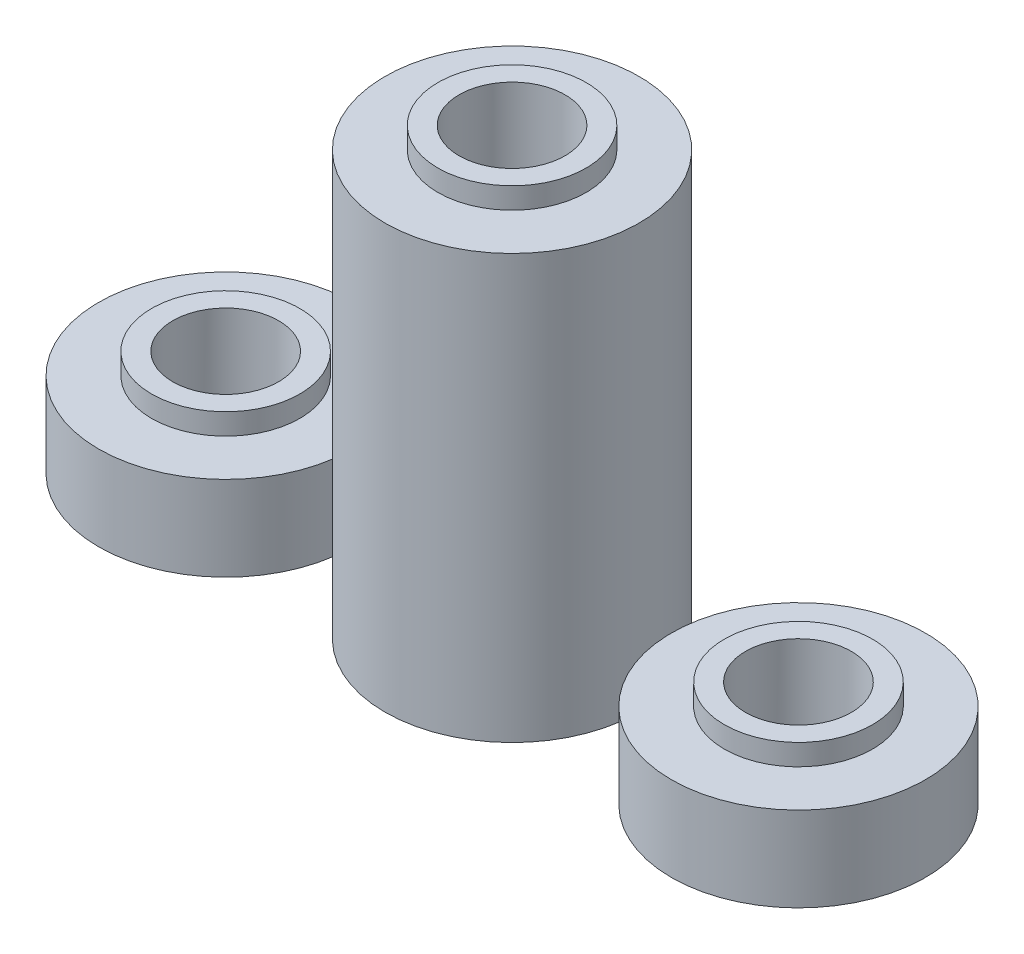
ISO-10303-21;
HEADER;
FILE_DESCRIPTION(('STEP AP214'),'2;1');
FILE_NAME('part.step','',(''),(''),'','','');
FILE_SCHEMA(('AUTOMOTIVE_DESIGN { 1 0 10303 214 1 1 1 1 }'));
ENDSEC;
DATA;
#1=APPLICATION_CONTEXT('core data for automotive mechanical design processes');
#2=APPLICATION_PROTOCOL_DEFINITION('international standard','automotive_design',2000,#1);
#3=PRODUCT_CONTEXT('',#1,'mechanical');
#4=PRODUCT('Part','Part','',(#3));
#5=PRODUCT_RELATED_PRODUCT_CATEGORY('part','',(#4));
#6=PRODUCT_DEFINITION_FORMATION('','',#4);
#7=PRODUCT_DEFINITION_CONTEXT('part definition',#1,'design');
#8=PRODUCT_DEFINITION('design','',#6,#7);
#9=PRODUCT_DEFINITION_SHAPE('','',#8);
#10=(LENGTH_UNIT() NAMED_UNIT(*) SI_UNIT(.MILLI.,.METRE.));
#11=(NAMED_UNIT(*) PLANE_ANGLE_UNIT() SI_UNIT($,.RADIAN.));
#12=(NAMED_UNIT(*) SI_UNIT($,.STERADIAN.) SOLID_ANGLE_UNIT());
#13=UNCERTAINTY_MEASURE_WITH_UNIT(LENGTH_MEASURE(1.E-05),#10,'distance_accuracy_value','');
#14=(GEOMETRIC_REPRESENTATION_CONTEXT(3) GLOBAL_UNCERTAINTY_ASSIGNED_CONTEXT((#13)) GLOBAL_UNIT_ASSIGNED_CONTEXT((#10,
#11,#12)) REPRESENTATION_CONTEXT('',''));
#15=CARTESIAN_POINT('',(0.,0.,0.));
#16=DIRECTION('',(0.,0.,1.));
#17=DIRECTION('',(1.,0.,0.));
#18=AXIS2_PLACEMENT_3D('',#15,#16,#17);
#19=CARTESIAN_POINT('',(13.5219915750708,0.,0.));
#20=DIRECTION('',(0.,1.,0.));
#21=DIRECTION('',(0.,0.,1.));
#22=AXIS2_PLACEMENT_3D('',#19,#20,#21);
#23=CYLINDRICAL_SURFACE('',#22,2.5);
#24=CARTESIAN_POINT('',(13.5219915750708,5.,0.));
#25=DIRECTION('',(0.,-1.,0.));
#26=DIRECTION('',(0.,0.,1.));
#27=AXIS2_PLACEMENT_3D('',#24,#25,#26);
#28=CIRCLE('',#27,2.5);
#29=CARTESIAN_POINT('',(13.5219915750708,5.,2.5));
#30=VERTEX_POINT('',#29);
#31=EDGE_CURVE('E62',#30,#30,#28,.T.);
#32=ORIENTED_EDGE('',*,*,#31,.F.);
#33=EDGE_LOOP('',(#32));
#34=FACE_BOUND('',#33,.T.);
#35=CARTESIAN_POINT('',(13.5219915750708,1.,0.));
#36=DIRECTION('',(0.,1.,0.));
#37=DIRECTION('',(0.,0.,-1.));
#38=AXIS2_PLACEMENT_3D('',#35,#36,#37);
#39=CIRCLE('',#38,2.5);
#40=CARTESIAN_POINT('',(13.5219915750708,1.,-2.5));
#41=VERTEX_POINT('',#40);
#42=EDGE_CURVE('E71',#41,#41,#39,.T.);
#43=ORIENTED_EDGE('',*,*,#42,.F.);
#44=EDGE_LOOP('',(#43));
#45=FACE_BOUND('',#44,.T.);
#46=ADVANCED_FACE('F46',(#34,#45),#23,.F.);
#47=CARTESIAN_POINT('',(13.5219915750708,4.,0.));
#48=DIRECTION('',(0.,1.,0.));
#49=DIRECTION('',(0.,0.,1.));
#50=AXIS2_PLACEMENT_3D('',#47,#48,#49);
#51=PLANE('',#50);
#52=CARTESIAN_POINT('',(13.5219915750708,4.,0.));
#53=DIRECTION('',(0.,-1.,0.));
#54=DIRECTION('',(0.,0.,1.));
#55=AXIS2_PLACEMENT_3D('',#52,#53,#54);
#56=CIRCLE('',#55,6.);
#57=CARTESIAN_POINT('',(13.5219915750708,4.,6.));
#58=VERTEX_POINT('',#57);
#59=EDGE_CURVE('E11',#58,#58,#56,.T.);
#60=ORIENTED_EDGE('',*,*,#59,.F.);
#61=EDGE_LOOP('',(#60));
#62=FACE_BOUND('',#61,.T.);
#63=CARTESIAN_POINT('',(13.5219915750708,4.,0.));
#64=DIRECTION('',(0.,-1.,0.));
#65=DIRECTION('',(0.,0.,1.));
#66=AXIS2_PLACEMENT_3D('',#63,#64,#65);
#67=CIRCLE('',#66,3.5);
#68=CARTESIAN_POINT('',(13.5219915750708,4.,3.5));
#69=VERTEX_POINT('',#68);
#70=EDGE_CURVE('E59',#69,#69,#67,.T.);
#71=ORIENTED_EDGE('',*,*,#70,.T.);
#72=EDGE_LOOP('',(#71));
#73=FACE_BOUND('',#72,.T.);
#74=ADVANCED_FACE('F81',(#62,#73),#51,.T.);
#75=CARTESIAN_POINT('',(13.5219915750708,4.,0.));
#76=DIRECTION('',(0.,-1.,0.));
#77=DIRECTION('',(0.,0.,-1.));
#78=AXIS2_PLACEMENT_3D('',#75,#76,#77);
#79=CYLINDRICAL_SURFACE('',#78,6.);
#80=ORIENTED_EDGE('',*,*,#59,.T.);
#81=EDGE_LOOP('',(#80));
#82=FACE_BOUND('',#81,.T.);
#83=CARTESIAN_POINT('',(13.5219915750708,0.,0.));
#84=DIRECTION('',(0.,-1.,0.));
#85=DIRECTION('',(0.,0.,1.));
#86=AXIS2_PLACEMENT_3D('',#83,#84,#85);
#87=CIRCLE('',#86,6.);
#88=CARTESIAN_POINT('',(13.5219915750708,0.,6.));
#89=VERTEX_POINT('',#88);
#90=EDGE_CURVE('E50',#89,#89,#87,.T.);
#91=ORIENTED_EDGE('',*,*,#90,.F.);
#92=EDGE_LOOP('',(#91));
#93=FACE_BOUND('',#92,.T.);
#94=ADVANCED_FACE('F48',(#82,#93),#79,.T.);
#95=CARTESIAN_POINT('',(13.5219915750708,0.,0.));
#96=DIRECTION('',(0.,1.,0.));
#97=DIRECTION('',(0.,0.,1.));
#98=AXIS2_PLACEMENT_3D('',#95,#96,#97);
#99=PLANE('',#98);
#100=CARTESIAN_POINT('',(13.5219915750708,0.,0.));
#101=DIRECTION('',(0.,1.,0.));
#102=DIRECTION('',(0.,0.,-1.));
#103=AXIS2_PLACEMENT_3D('',#100,#101,#102);
#104=CIRCLE('',#103,3.5);
#105=CARTESIAN_POINT('',(13.5219915750708,0.,-3.5));
#106=VERTEX_POINT('',#105);
#107=EDGE_CURVE('E68',#106,#106,#104,.T.);
#108=ORIENTED_EDGE('',*,*,#107,.T.);
#109=EDGE_LOOP('',(#108));
#110=FACE_BOUND('',#109,.T.);
#111=ORIENTED_EDGE('',*,*,#90,.T.);
#112=EDGE_LOOP('',(#111));
#113=FACE_BOUND('',#112,.T.);
#114=ADVANCED_FACE('F93',(#110,#113),#99,.F.);
#115=CARTESIAN_POINT('',(13.5219915750708,5.,0.));
#116=DIRECTION('',(0.,1.,0.));
#117=DIRECTION('',(0.,0.,1.));
#118=AXIS2_PLACEMENT_3D('',#115,#116,#117);
#119=PLANE('',#118);
#120=CARTESIAN_POINT('',(13.5219915750708,5.,0.));
#121=DIRECTION('',(0.,-1.,0.));
#122=DIRECTION('',(0.,0.,1.));
#123=AXIS2_PLACEMENT_3D('',#120,#121,#122);
#124=CIRCLE('',#123,3.5);
#125=CARTESIAN_POINT('',(13.5219915750708,5.,3.5));
#126=VERTEX_POINT('',#125);
#127=EDGE_CURVE('E57',#126,#126,#124,.T.);
#128=ORIENTED_EDGE('',*,*,#127,.F.);
#129=EDGE_LOOP('',(#128));
#130=FACE_BOUND('',#129,.T.);
#131=ORIENTED_EDGE('',*,*,#31,.T.);
#132=EDGE_LOOP('',(#131));
#133=FACE_BOUND('',#132,.T.);
#134=ADVANCED_FACE('F95',(#130,#133),#119,.T.);
#135=CARTESIAN_POINT('',(13.5219915750708,5.,0.));
#136=DIRECTION('',(0.,-1.,0.));
#137=DIRECTION('',(0.,0.,-1.));
#138=AXIS2_PLACEMENT_3D('',#135,#136,#137);
#139=CYLINDRICAL_SURFACE('',#138,3.5);
#140=ORIENTED_EDGE('',*,*,#127,.T.);
#141=EDGE_LOOP('',(#140));
#142=FACE_BOUND('',#141,.T.);
#143=ORIENTED_EDGE('',*,*,#70,.F.);
#144=EDGE_LOOP('',(#143));
#145=FACE_BOUND('',#144,.T.);
#146=ADVANCED_FACE('F91',(#142,#145),#139,.T.);
#147=CARTESIAN_POINT('',(13.5219915750708,1.,0.));
#148=DIRECTION('',(0.,-1.,0.));
#149=DIRECTION('',(0.,0.,-1.));
#150=AXIS2_PLACEMENT_3D('',#147,#148,#149);
#151=CYLINDRICAL_SURFACE('',#150,3.5);
#152=CARTESIAN_POINT('',(13.5219915750708,1.,0.));
#153=DIRECTION('',(0.,1.,0.));
#154=DIRECTION('',(0.,0.,-1.));
#155=AXIS2_PLACEMENT_3D('',#152,#153,#154);
#156=CIRCLE('',#155,3.5);
#157=CARTESIAN_POINT('',(13.5219915750708,1.,-3.5));
#158=VERTEX_POINT('',#157);
#159=EDGE_CURVE('E67',#158,#158,#156,.T.);
#160=ORIENTED_EDGE('',*,*,#159,.T.);
#161=EDGE_LOOP('',(#160));
#162=FACE_BOUND('',#161,.T.);
#163=ORIENTED_EDGE('',*,*,#107,.F.);
#164=EDGE_LOOP('',(#163));
#165=FACE_BOUND('',#164,.T.);
#166=ADVANCED_FACE('F107',(#162,#165),#151,.F.);
#167=CARTESIAN_POINT('',(13.5219915750708,1.,0.));
#168=DIRECTION('',(0.,-1.,0.));
#169=DIRECTION('',(0.,0.,-1.));
#170=AXIS2_PLACEMENT_3D('',#167,#168,#169);
#171=PLANE('',#170);
#172=ORIENTED_EDGE('',*,*,#42,.T.);
#173=EDGE_LOOP('',(#172));
#174=FACE_BOUND('',#173,.T.);
#175=ORIENTED_EDGE('',*,*,#159,.F.);
#176=EDGE_LOOP('',(#175));
#177=FACE_BOUND('',#176,.T.);
#178=ADVANCED_FACE('F77',(#174,#177),#171,.T.);
#179=CLOSED_SHELL('',(#46,#74,#94,#114,#134,#146,#166,#178));
#180=MANIFOLD_SOLID_BREP('B2',#179);
#181=CARTESIAN_POINT('',(-13.5219915750708,0.,0.));
#182=DIRECTION('',(0.,1.,0.));
#183=DIRECTION('',(0.,0.,1.));
#184=AXIS2_PLACEMENT_3D('',#181,#182,#183);
#185=CYLINDRICAL_SURFACE('',#184,2.5);
#186=CARTESIAN_POINT('',(-13.5219915750708,5.,0.));
#187=DIRECTION('',(0.,1.,0.));
#188=DIRECTION('',(0.,0.,1.));
#189=AXIS2_PLACEMENT_3D('',#186,#187,#188);
#190=CIRCLE('',#189,2.5);
#191=CARTESIAN_POINT('',(-13.5219915750708,5.,2.5));
#192=VERTEX_POINT('',#191);
#193=EDGE_CURVE('E194',#192,#192,#190,.T.);
#194=ORIENTED_EDGE('',*,*,#193,.T.);
#195=EDGE_LOOP('',(#194));
#196=FACE_BOUND('',#195,.T.);
#197=CARTESIAN_POINT('',(-13.5219915750708,1.,0.));
#198=DIRECTION('',(0.,-1.,0.));
#199=DIRECTION('',(0.,0.,-1.));
#200=AXIS2_PLACEMENT_3D('',#197,#198,#199);
#201=CIRCLE('',#200,2.5);
#202=CARTESIAN_POINT('',(-13.5219915750708,1.,-2.5));
#203=VERTEX_POINT('',#202);
#204=EDGE_CURVE('E203',#203,#203,#201,.T.);
#205=ORIENTED_EDGE('',*,*,#204,.T.);
#206=EDGE_LOOP('',(#205));
#207=FACE_BOUND('',#206,.T.);
#208=ADVANCED_FACE('F178',(#196,#207),#185,.F.);
#209=CARTESIAN_POINT('',(-13.5219915750708,4.,0.));
#210=DIRECTION('',(0.,1.,0.));
#211=DIRECTION('',(0.,0.,1.));
#212=AXIS2_PLACEMENT_3D('',#209,#210,#211);
#213=PLANE('',#212);
#214=CARTESIAN_POINT('',(-13.5219915750708,4.,0.));
#215=DIRECTION('',(0.,1.,0.));
#216=DIRECTION('',(0.,0.,1.));
#217=AXIS2_PLACEMENT_3D('',#214,#215,#216);
#218=CIRCLE('',#217,6.);
#219=CARTESIAN_POINT('',(-13.5219915750708,4.,6.));
#220=VERTEX_POINT('',#219);
#221=EDGE_CURVE('E45',#220,#220,#218,.T.);
#222=ORIENTED_EDGE('',*,*,#221,.T.);
#223=EDGE_LOOP('',(#222));
#224=FACE_BOUND('',#223,.T.);
#225=CARTESIAN_POINT('',(-13.5219915750708,4.,0.));
#226=DIRECTION('',(0.,1.,0.));
#227=DIRECTION('',(0.,0.,1.));
#228=AXIS2_PLACEMENT_3D('',#225,#226,#227);
#229=CIRCLE('',#228,3.5);
#230=CARTESIAN_POINT('',(-13.5219915750708,4.,3.5));
#231=VERTEX_POINT('',#230);
#232=EDGE_CURVE('E191',#231,#231,#229,.T.);
#233=ORIENTED_EDGE('',*,*,#232,.F.);
#234=EDGE_LOOP('',(#233));
#235=FACE_BOUND('',#234,.T.);
#236=ADVANCED_FACE('F230',(#224,#235),#213,.T.);
#237=CARTESIAN_POINT('',(-13.5219915750708,4.,0.));
#238=DIRECTION('',(0.,-1.,0.));
#239=DIRECTION('',(0.,0.,-1.));
#240=AXIS2_PLACEMENT_3D('',#237,#238,#239);
#241=CYLINDRICAL_SURFACE('',#240,6.);
#242=ORIENTED_EDGE('',*,*,#221,.F.);
#243=EDGE_LOOP('',(#242));
#244=FACE_BOUND('',#243,.T.);
#245=CARTESIAN_POINT('',(-13.5219915750708,0.,0.));
#246=DIRECTION('',(0.,1.,0.));
#247=DIRECTION('',(0.,0.,1.));
#248=AXIS2_PLACEMENT_3D('',#245,#246,#247);
#249=CIRCLE('',#248,6.);
#250=CARTESIAN_POINT('',(-13.5219915750708,0.,6.));
#251=VERTEX_POINT('',#250);
#252=EDGE_CURVE('E182',#251,#251,#249,.T.);
#253=ORIENTED_EDGE('',*,*,#252,.T.);
#254=EDGE_LOOP('',(#253));
#255=FACE_BOUND('',#254,.T.);
#256=ADVANCED_FACE('F180',(#244,#255),#241,.T.);
#257=CARTESIAN_POINT('',(-13.5219915750708,0.,0.));
#258=DIRECTION('',(0.,1.,0.));
#259=DIRECTION('',(0.,0.,1.));
#260=AXIS2_PLACEMENT_3D('',#257,#258,#259);
#261=PLANE('',#260);
#262=CARTESIAN_POINT('',(-13.5219915750708,0.,0.));
#263=DIRECTION('',(0.,-1.,0.));
#264=DIRECTION('',(0.,0.,-1.));
#265=AXIS2_PLACEMENT_3D('',#262,#263,#264);
#266=CIRCLE('',#265,3.5);
#267=CARTESIAN_POINT('',(-13.5219915750708,0.,-3.5));
#268=VERTEX_POINT('',#267);
#269=EDGE_CURVE('E200',#268,#268,#266,.T.);
#270=ORIENTED_EDGE('',*,*,#269,.F.);
#271=EDGE_LOOP('',(#270));
#272=FACE_BOUND('',#271,.T.);
#273=ORIENTED_EDGE('',*,*,#252,.F.);
#274=EDGE_LOOP('',(#273));
#275=FACE_BOUND('',#274,.T.);
#276=ADVANCED_FACE('F223',(#272,#275),#261,.F.);
#277=CARTESIAN_POINT('',(-13.5219915750708,5.,0.));
#278=DIRECTION('',(0.,1.,0.));
#279=DIRECTION('',(0.,0.,1.));
#280=AXIS2_PLACEMENT_3D('',#277,#278,#279);
#281=PLANE('',#280);
#282=CARTESIAN_POINT('',(-13.5219915750708,5.,0.));
#283=DIRECTION('',(0.,1.,0.));
#284=DIRECTION('',(0.,0.,1.));
#285=AXIS2_PLACEMENT_3D('',#282,#283,#284);
#286=CIRCLE('',#285,3.5);
#287=CARTESIAN_POINT('',(-13.5219915750708,5.,3.5));
#288=VERTEX_POINT('',#287);
#289=EDGE_CURVE('E189',#288,#288,#286,.T.);
#290=ORIENTED_EDGE('',*,*,#289,.T.);
#291=EDGE_LOOP('',(#290));
#292=FACE_BOUND('',#291,.T.);
#293=ORIENTED_EDGE('',*,*,#193,.F.);
#294=EDGE_LOOP('',(#293));
#295=FACE_BOUND('',#294,.T.);
#296=ADVANCED_FACE('F226',(#292,#295),#281,.T.);
#297=CARTESIAN_POINT('',(-13.5219915750708,5.,0.));
#298=DIRECTION('',(0.,-1.,0.));
#299=DIRECTION('',(0.,0.,-1.));
#300=AXIS2_PLACEMENT_3D('',#297,#298,#299);
#301=CYLINDRICAL_SURFACE('',#300,3.5);
#302=ORIENTED_EDGE('',*,*,#289,.F.);
#303=EDGE_LOOP('',(#302));
#304=FACE_BOUND('',#303,.T.);
#305=ORIENTED_EDGE('',*,*,#232,.T.);
#306=EDGE_LOOP('',(#305));
#307=FACE_BOUND('',#306,.T.);
#308=ADVANCED_FACE('F219',(#304,#307),#301,.T.);
#309=CARTESIAN_POINT('',(-13.5219915750708,1.,0.));
#310=DIRECTION('',(0.,-1.,0.));
#311=DIRECTION('',(0.,0.,-1.));
#312=AXIS2_PLACEMENT_3D('',#309,#310,#311);
#313=CYLINDRICAL_SURFACE('',#312,3.5);
#314=CARTESIAN_POINT('',(-13.5219915750708,1.,0.));
#315=DIRECTION('',(0.,-1.,0.));
#316=DIRECTION('',(0.,0.,-1.));
#317=AXIS2_PLACEMENT_3D('',#314,#315,#316);
#318=CIRCLE('',#317,3.5);
#319=CARTESIAN_POINT('',(-13.5219915750708,1.,-3.5));
#320=VERTEX_POINT('',#319);
#321=EDGE_CURVE('E199',#320,#320,#318,.T.);
#322=ORIENTED_EDGE('',*,*,#321,.F.);
#323=EDGE_LOOP('',(#322));
#324=FACE_BOUND('',#323,.T.);
#325=ORIENTED_EDGE('',*,*,#269,.T.);
#326=EDGE_LOOP('',(#325));
#327=FACE_BOUND('',#326,.T.);
#328=ADVANCED_FACE('F213',(#324,#327),#313,.F.);
#329=CARTESIAN_POINT('',(-13.5219915750708,1.,0.));
#330=DIRECTION('',(0.,-1.,0.));
#331=DIRECTION('',(0.,0.,-1.));
#332=AXIS2_PLACEMENT_3D('',#329,#330,#331);
#333=PLANE('',#332);
#334=ORIENTED_EDGE('',*,*,#204,.F.);
#335=EDGE_LOOP('',(#334));
#336=FACE_BOUND('',#335,.T.);
#337=ORIENTED_EDGE('',*,*,#321,.T.);
#338=EDGE_LOOP('',(#337));
#339=FACE_BOUND('',#338,.T.);
#340=ADVANCED_FACE('F210',(#336,#339),#333,.T.);
#341=CLOSED_SHELL('',(#208,#236,#256,#276,#296,#308,#328,#340));
#342=MANIFOLD_SOLID_BREP('B6',#341);
#343=CARTESIAN_POINT('',(0.,0.,0.));
#344=DIRECTION('',(0.,1.,0.));
#345=DIRECTION('',(0.,0.,1.));
#346=AXIS2_PLACEMENT_3D('',#343,#344,#345);
#347=CYLINDRICAL_SURFACE('',#346,2.5);
#348=CARTESIAN_POINT('',(0.,21.,0.));
#349=DIRECTION('',(0.,1.,0.));
#350=DIRECTION('',(0.,0.,1.));
#351=AXIS2_PLACEMENT_3D('',#348,#349,#350);
#352=CIRCLE('',#351,2.5);
#353=CARTESIAN_POINT('',(0.,21.,2.5));
#354=VERTEX_POINT('',#353);
#355=EDGE_CURVE('E324',#354,#354,#352,.T.);
#356=ORIENTED_EDGE('',*,*,#355,.T.);
#357=EDGE_LOOP('',(#356));
#358=FACE_BOUND('',#357,.T.);
#359=CARTESIAN_POINT('',(0.,5.,0.));
#360=DIRECTION('',(0.,-1.,0.));
#361=DIRECTION('',(0.,0.,-1.));
#362=AXIS2_PLACEMENT_3D('',#359,#360,#361);
#363=CIRCLE('',#362,2.5);
#364=CARTESIAN_POINT('',(0.,5.,-2.5));
#365=VERTEX_POINT('',#364);
#366=EDGE_CURVE('E307',#365,#365,#363,.F.);
#367=ORIENTED_EDGE('',*,*,#366,.F.);
#368=EDGE_LOOP('',(#367));
#369=FACE_BOUND('',#368,.T.);
#370=ADVANCED_FACE('F303',(#358,#369),#347,.F.);
#371=CARTESIAN_POINT('',(0.,20.,0.));
#372=DIRECTION('',(0.,1.,0.));
#373=DIRECTION('',(0.,0.,1.));
#374=AXIS2_PLACEMENT_3D('',#371,#372,#373);
#375=PLANE('',#374);
#376=CARTESIAN_POINT('',(0.,20.,0.));
#377=DIRECTION('',(0.,1.,0.));
#378=DIRECTION('',(0.,0.,1.));
#379=AXIS2_PLACEMENT_3D('',#376,#377,#378);
#380=CIRCLE('',#379,6.);
#381=CARTESIAN_POINT('',(0.,20.,6.));
#382=VERTEX_POINT('',#381);
#383=EDGE_CURVE('E177',#382,#382,#380,.T.);
#384=ORIENTED_EDGE('',*,*,#383,.T.);
#385=EDGE_LOOP('',(#384));
#386=FACE_BOUND('',#385,.T.);
#387=CARTESIAN_POINT('',(0.,20.,0.));
#388=DIRECTION('',(0.,1.,0.));
#389=DIRECTION('',(0.,0.,1.));
#390=AXIS2_PLACEMENT_3D('',#387,#388,#389);
#391=CIRCLE('',#390,3.5);
#392=CARTESIAN_POINT('',(0.,20.,3.5));
#393=VERTEX_POINT('',#392);
#394=EDGE_CURVE('E320',#393,#393,#391,.T.);
#395=ORIENTED_EDGE('',*,*,#394,.F.);
#396=EDGE_LOOP('',(#395));
#397=FACE_BOUND('',#396,.T.);
#398=ADVANCED_FACE('F347',(#386,#397),#375,.T.);
#399=CARTESIAN_POINT('',(0.,20.,0.));
#400=DIRECTION('',(0.,-1.,0.));
#401=DIRECTION('',(0.,0.,-1.));
#402=AXIS2_PLACEMENT_3D('',#399,#400,#401);
#403=CYLINDRICAL_SURFACE('',#402,6.);
#404=ORIENTED_EDGE('',*,*,#383,.F.);
#405=EDGE_LOOP('',(#404));
#406=FACE_BOUND('',#405,.T.);
#407=CARTESIAN_POINT('',(0.,0.,0.));
#408=DIRECTION('',(0.,1.,0.));
#409=DIRECTION('',(0.,0.,1.));
#410=AXIS2_PLACEMENT_3D('',#407,#408,#409);
#411=CIRCLE('',#410,6.);
#412=CARTESIAN_POINT('',(0.,0.,6.));
#413=VERTEX_POINT('',#412);
#414=EDGE_CURVE('E312',#413,#413,#411,.T.);
#415=ORIENTED_EDGE('',*,*,#414,.T.);
#416=EDGE_LOOP('',(#415));
#417=FACE_BOUND('',#416,.T.);
#418=ADVANCED_FACE('F305',(#406,#417),#403,.T.);
#419=CARTESIAN_POINT('',(0.,0.,0.));
#420=DIRECTION('',(0.,1.,0.));
#421=DIRECTION('',(0.,0.,1.));
#422=AXIS2_PLACEMENT_3D('',#419,#420,#421);
#423=PLANE('',#422);
#424=CARTESIAN_POINT('',(0.,0.,0.));
#425=DIRECTION('',(0.,-1.,0.));
#426=DIRECTION('',(0.,0.,-1.));
#427=AXIS2_PLACEMENT_3D('',#424,#425,#426);
#428=CIRCLE('',#427,4.5);
#429=CARTESIAN_POINT('',(0.,0.,-4.5));
#430=VERTEX_POINT('',#429);
#431=EDGE_CURVE('E331',#430,#430,#428,.T.);
#432=ORIENTED_EDGE('',*,*,#431,.F.);
#433=EDGE_LOOP('',(#432));
#434=FACE_BOUND('',#433,.T.);
#435=ORIENTED_EDGE('',*,*,#414,.F.);
#436=EDGE_LOOP('',(#435));
#437=FACE_BOUND('',#436,.T.);
#438=ADVANCED_FACE('F357',(#434,#437),#423,.F.);
#439=CARTESIAN_POINT('',(0.,21.,0.));
#440=DIRECTION('',(0.,1.,0.));
#441=DIRECTION('',(0.,0.,1.));
#442=AXIS2_PLACEMENT_3D('',#439,#440,#441);
#443=PLANE('',#442);
#444=CARTESIAN_POINT('',(0.,21.,0.));
#445=DIRECTION('',(0.,1.,0.));
#446=DIRECTION('',(0.,0.,1.));
#447=AXIS2_PLACEMENT_3D('',#444,#445,#446);
#448=CIRCLE('',#447,3.5);
#449=CARTESIAN_POINT('',(0.,21.,3.5));
#450=VERTEX_POINT('',#449);
#451=EDGE_CURVE('E318',#450,#450,#448,.T.);
#452=ORIENTED_EDGE('',*,*,#451,.T.);
#453=EDGE_LOOP('',(#452));
#454=FACE_BOUND('',#453,.T.);
#455=ORIENTED_EDGE('',*,*,#355,.F.);
#456=EDGE_LOOP('',(#455));
#457=FACE_BOUND('',#456,.T.);
#458=ADVANCED_FACE('F359',(#454,#457),#443,.T.);
#459=CARTESIAN_POINT('',(0.,21.,0.));
#460=DIRECTION('',(0.,-1.,0.));
#461=DIRECTION('',(0.,0.,-1.));
#462=AXIS2_PLACEMENT_3D('',#459,#460,#461);
#463=CYLINDRICAL_SURFACE('',#462,3.5);
#464=ORIENTED_EDGE('',*,*,#451,.F.);
#465=EDGE_LOOP('',(#464));
#466=FACE_BOUND('',#465,.T.);
#467=ORIENTED_EDGE('',*,*,#394,.T.);
#468=EDGE_LOOP('',(#467));
#469=FACE_BOUND('',#468,.T.);
#470=ADVANCED_FACE('F355',(#466,#469),#463,.T.);
#471=CARTESIAN_POINT('',(0.,5.,0.));
#472=DIRECTION('',(0.,-1.,0.));
#473=DIRECTION('',(0.,0.,-1.));
#474=AXIS2_PLACEMENT_3D('',#471,#472,#473);
#475=PLANE('',#474);
#476=CARTESIAN_POINT('',(0.,5.,0.));
#477=DIRECTION('',(0.,-1.,0.));
#478=DIRECTION('',(0.,0.,-1.));
#479=AXIS2_PLACEMENT_3D('',#476,#477,#478);
#480=CIRCLE('',#479,4.5);
#481=CARTESIAN_POINT('',(0.,5.,-4.5));
#482=VERTEX_POINT('',#481);
#483=EDGE_CURVE('E335',#482,#482,#480,.T.);
#484=ORIENTED_EDGE('',*,*,#483,.T.);
#485=EDGE_LOOP('',(#484));
#486=FACE_BOUND('',#485,.T.);
#487=ORIENTED_EDGE('',*,*,#366,.T.);
#488=EDGE_LOOP('',(#487));
#489=FACE_BOUND('',#488,.T.);
#490=ADVANCED_FACE('F344',(#486,#489),#475,.T.);
#491=CARTESIAN_POINT('',(0.,5.,0.));
#492=DIRECTION('',(0.,-1.,0.));
#493=DIRECTION('',(0.,0.,-1.));
#494=AXIS2_PLACEMENT_3D('',#491,#492,#493);
#495=CYLINDRICAL_SURFACE('',#494,4.5);
#496=ORIENTED_EDGE('',*,*,#483,.F.);
#497=EDGE_LOOP('',(#496));
#498=FACE_BOUND('',#497,.T.);
#499=ORIENTED_EDGE('',*,*,#431,.T.);
#500=EDGE_LOOP('',(#499));
#501=FACE_BOUND('',#500,.T.);
#502=ADVANCED_FACE('F372',(#498,#501),#495,.F.);
#503=CLOSED_SHELL('',(#370,#398,#418,#438,#458,#470,#490,#502));
#504=MANIFOLD_SOLID_BREP('B40',#503);
#505=ADVANCED_BREP_SHAPE_REPRESENTATION('',(#18,#180,#342,#504),#14);
#506=SHAPE_DEFINITION_REPRESENTATION(#9,#505);
ENDSEC;
END-ISO-10303-21;
